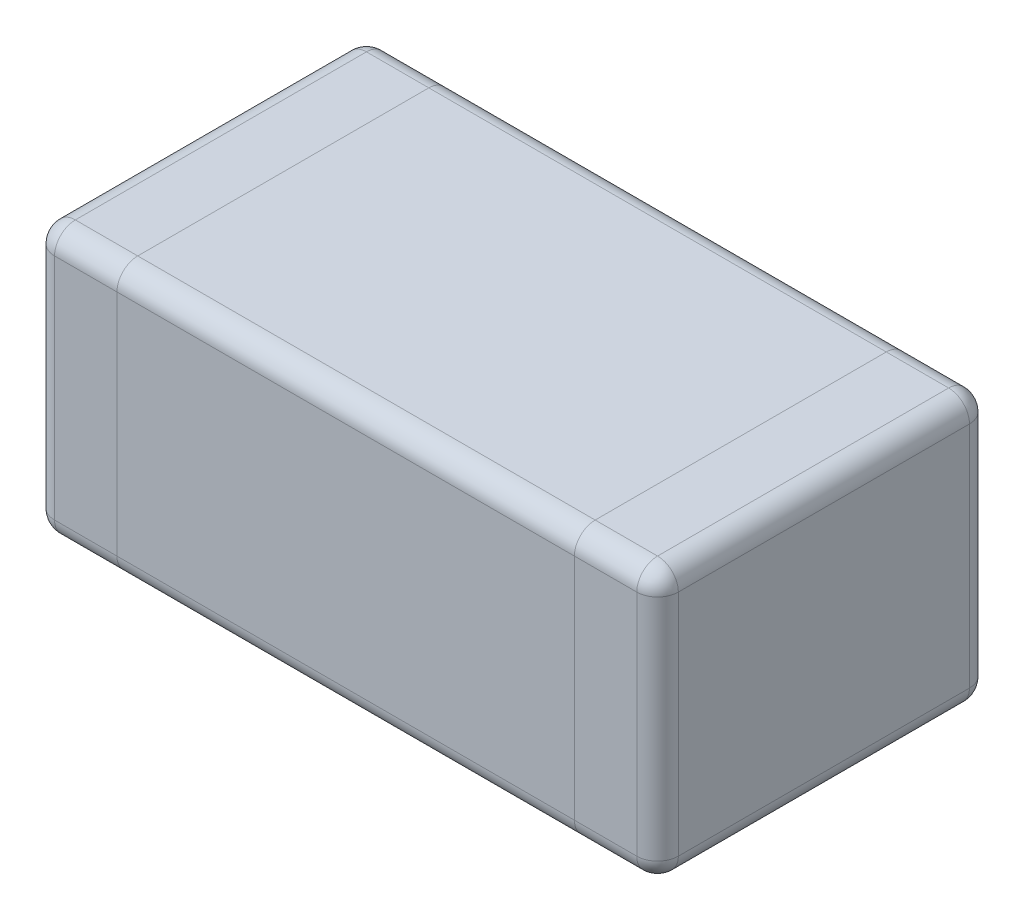
ISO-10303-21;
HEADER;
FILE_DESCRIPTION(('STEP AP214'),'2;1');
FILE_NAME('part.step','',(''),(''),'','','');
FILE_SCHEMA(('AUTOMOTIVE_DESIGN { 1 0 10303 214 1 1 1 1 }'));
ENDSEC;
DATA;
#1=APPLICATION_CONTEXT('core data for automotive mechanical design processes');
#2=APPLICATION_PROTOCOL_DEFINITION('international standard','automotive_design',2000,#1);
#3=PRODUCT_CONTEXT('',#1,'mechanical');
#4=PRODUCT('Part','Part','',(#3));
#5=PRODUCT_RELATED_PRODUCT_CATEGORY('part','',(#4));
#6=PRODUCT_DEFINITION_FORMATION('','',#4);
#7=PRODUCT_DEFINITION_CONTEXT('part definition',#1,'design');
#8=PRODUCT_DEFINITION('design','',#6,#7);
#9=PRODUCT_DEFINITION_SHAPE('','',#8);
#10=(LENGTH_UNIT() NAMED_UNIT(*) SI_UNIT(.MILLI.,.METRE.));
#11=(NAMED_UNIT(*) PLANE_ANGLE_UNIT() SI_UNIT($,.RADIAN.));
#12=(NAMED_UNIT(*) SI_UNIT($,.STERADIAN.) SOLID_ANGLE_UNIT());
#13=UNCERTAINTY_MEASURE_WITH_UNIT(LENGTH_MEASURE(1.E-05),#10,'distance_accuracy_value','');
#14=(GEOMETRIC_REPRESENTATION_CONTEXT(3) GLOBAL_UNCERTAINTY_ASSIGNED_CONTEXT((#13)) GLOBAL_UNIT_ASSIGNED_CONTEXT((#10,
#11,#12)) REPRESENTATION_CONTEXT('',''));
#15=CARTESIAN_POINT('',(0.,0.,0.));
#16=DIRECTION('',(0.,0.,1.));
#17=DIRECTION('',(1.,0.,0.));
#18=AXIS2_PLACEMENT_3D('',#15,#16,#17);
#19=CARTESIAN_POINT('',(0.7,0.65,-0.35));
#20=DIRECTION('',(0.,-1.,0.));
#21=DIRECTION('',(0.,0.,-1.));
#22=AXIS2_PLACEMENT_3D('',#19,#20,#21);
#23=CYLINDRICAL_SURFACE('',#22,0.05);
#24=CARTESIAN_POINT('',(0.7,0.6,-0.35));
#25=DIRECTION('',(0.,-1.,0.));
#26=DIRECTION('',(0.,0.,1.));
#27=AXIS2_PLACEMENT_3D('',#24,#25,#26);
#28=CIRCLE('',#27,0.05);
#29=CARTESIAN_POINT('',(0.7,0.6,-0.4));
#30=VERTEX_POINT('',#29);
#31=CARTESIAN_POINT('',(0.75,0.6,-0.35));
#32=VERTEX_POINT('',#31);
#33=EDGE_CURVE('E27',#30,#32,#28,.T.);
#34=ORIENTED_EDGE('',*,*,#33,.T.);
#35=DIRECTION('',(0.,1.,0.));
#36=VECTOR('',#35,1.);
#37=CARTESIAN_POINT('',(0.75,0.65,-0.35));
#38=LINE('',#37,#36);
#39=CARTESIAN_POINT('',(0.75,0.05,-0.35));
#40=VERTEX_POINT('',#39);
#41=EDGE_CURVE('E397',#40,#32,#38,.T.);
#42=ORIENTED_EDGE('',*,*,#41,.F.);
#43=CARTESIAN_POINT('',(0.7,0.05,-0.35));
#44=DIRECTION('',(0.,1.,0.));
#45=DIRECTION('',(0.,0.,-1.));
#46=AXIS2_PLACEMENT_3D('',#43,#44,#45);
#47=CIRCLE('',#46,0.05);
#48=CARTESIAN_POINT('',(0.7,0.05,-0.4));
#49=VERTEX_POINT('',#48);
#50=EDGE_CURVE('E11',#40,#49,#47,.T.);
#51=ORIENTED_EDGE('',*,*,#50,.T.);
#52=DIRECTION('',(0.,-1.,0.));
#53=VECTOR('',#52,1.);
#54=CARTESIAN_POINT('',(0.7,0.65,-0.4));
#55=LINE('',#54,#53);
#56=EDGE_CURVE('E292',#30,#49,#55,.T.);
#57=ORIENTED_EDGE('',*,*,#56,.F.);
#58=EDGE_LOOP('',(#34,#42,#51,#57));
#59=FACE_BOUND('',#58,.T.);
#60=ADVANCED_FACE('F16',(#59),#23,.T.);
#61=CARTESIAN_POINT('',(0.7,0.05,-0.35));
#62=DIRECTION('',(0.,1.,0.));
#63=DIRECTION('',(1.,0.,0.));
#64=AXIS2_PLACEMENT_3D('',#61,#62,#63);
#65=SPHERICAL_SURFACE('',#64,0.05);
#66=CARTESIAN_POINT('',(0.7,0.05,-0.35));
#67=DIRECTION('',(0.,0.,-1.));
#68=DIRECTION('',(-1.,0.,0.));
#69=AXIS2_PLACEMENT_3D('',#66,#67,#68);
#70=CIRCLE('',#69,0.05);
#71=CARTESIAN_POINT('',(0.7,0.,-0.35));
#72=VERTEX_POINT('',#71);
#73=EDGE_CURVE('E185',#40,#72,#70,.T.);
#74=ORIENTED_EDGE('',*,*,#73,.T.);
#75=CARTESIAN_POINT('',(0.7,0.05,-0.35));
#76=DIRECTION('',(1.,0.,0.));
#77=DIRECTION('',(0.,0.,-1.));
#78=AXIS2_PLACEMENT_3D('',#75,#76,#77);
#79=CIRCLE('',#78,0.05);
#80=EDGE_CURVE('E188',#72,#49,#79,.T.);
#81=ORIENTED_EDGE('',*,*,#80,.T.);
#82=ORIENTED_EDGE('',*,*,#50,.F.);
#83=EDGE_LOOP('',(#74,#81,#82));
#84=FACE_BOUND('',#83,.T.);
#85=ADVANCED_FACE('F187',(#84),#65,.T.);
#86=CARTESIAN_POINT('',(0.7,0.6,-0.35));
#87=DIRECTION('',(0.,1.,0.));
#88=DIRECTION('',(1.,0.,0.));
#89=AXIS2_PLACEMENT_3D('',#86,#87,#88);
#90=SPHERICAL_SURFACE('',#89,0.05);
#91=CARTESIAN_POINT('',(0.7,0.6,-0.35));
#92=DIRECTION('',(1.,0.,0.));
#93=DIRECTION('',(0.,1.,0.));
#94=AXIS2_PLACEMENT_3D('',#91,#92,#93);
#95=CIRCLE('',#94,0.05);
#96=CARTESIAN_POINT('',(0.7,0.65,-0.35));
#97=VERTEX_POINT('',#96);
#98=EDGE_CURVE('E388',#30,#97,#95,.T.);
#99=ORIENTED_EDGE('',*,*,#98,.T.);
#100=CARTESIAN_POINT('',(0.7,0.6,-0.35));
#101=DIRECTION('',(0.,0.,-1.));
#102=DIRECTION('',(-1.,0.,0.));
#103=AXIS2_PLACEMENT_3D('',#100,#101,#102);
#104=CIRCLE('',#103,0.05);
#105=EDGE_CURVE('E195',#97,#32,#104,.T.);
#106=ORIENTED_EDGE('',*,*,#105,.T.);
#107=ORIENTED_EDGE('',*,*,#33,.F.);
#108=EDGE_LOOP('',(#99,#106,#107));
#109=FACE_BOUND('',#108,.T.);
#110=ADVANCED_FACE('F589',(#109),#90,.T.);
#111=CARTESIAN_POINT('',(0.7,0.05,0.4));
#112=DIRECTION('',(0.,0.,1.));
#113=DIRECTION('',(1.,0.,0.));
#114=AXIS2_PLACEMENT_3D('',#111,#112,#113);
#115=CYLINDRICAL_SURFACE('',#114,0.05);
#116=CARTESIAN_POINT('',(0.7,0.05,0.35));
#117=DIRECTION('',(0.,0.,-1.));
#118=DIRECTION('',(1.,0.,0.));
#119=AXIS2_PLACEMENT_3D('',#116,#117,#118);
#120=CIRCLE('',#119,0.05);
#121=CARTESIAN_POINT('',(0.75,0.05,0.35));
#122=VERTEX_POINT('',#121);
#123=CARTESIAN_POINT('',(0.7,0.,0.35));
#124=VERTEX_POINT('',#123);
#125=EDGE_CURVE('E211',#122,#124,#120,.T.);
#126=ORIENTED_EDGE('',*,*,#125,.T.);
#127=DIRECTION('',(0.,0.,1.));
#128=VECTOR('',#127,1.);
#129=CARTESIAN_POINT('',(0.7,0.,0.4));
#130=LINE('',#129,#128);
#131=EDGE_CURVE('E209',#72,#124,#130,.T.);
#132=ORIENTED_EDGE('',*,*,#131,.F.);
#133=ORIENTED_EDGE('',*,*,#73,.F.);
#134=DIRECTION('',(0.,0.,-1.));
#135=VECTOR('',#134,1.);
#136=CARTESIAN_POINT('',(0.75,0.05,-0.4));
#137=LINE('',#136,#135);
#138=EDGE_CURVE('E260',#122,#40,#137,.T.);
#139=ORIENTED_EDGE('',*,*,#138,.F.);
#140=EDGE_LOOP('',(#126,#132,#133,#139));
#141=FACE_BOUND('',#140,.T.);
#142=ADVANCED_FACE('F210',(#141),#115,.T.);
#143=CARTESIAN_POINT('',(-0.75,0.05,-0.35));
#144=DIRECTION('',(1.,0.,0.));
#145=DIRECTION('',(0.,0.,-1.));
#146=AXIS2_PLACEMENT_3D('',#143,#144,#145);
#147=CYLINDRICAL_SURFACE('',#146,0.05);
#148=CARTESIAN_POINT('',(-0.55,0.05,-0.35));
#149=DIRECTION('',(-1.,0.,0.));
#150=DIRECTION('',(0.,0.,-1.));
#151=AXIS2_PLACEMENT_3D('',#148,#149,#150);
#152=CIRCLE('',#151,0.05);
#153=CARTESIAN_POINT('',(-0.55,0.05,-0.4));
#154=VERTEX_POINT('',#153);
#155=CARTESIAN_POINT('',(-0.55,0.,-0.35));
#156=VERTEX_POINT('',#155);
#157=EDGE_CURVE('E372',#154,#156,#152,.T.);
#158=ORIENTED_EDGE('',*,*,#157,.F.);
#159=DIRECTION('',(-1.,0.,0.));
#160=VECTOR('',#159,1.);
#161=CARTESIAN_POINT('',(-0.75,0.05,-0.4));
#162=LINE('',#161,#160);
#163=CARTESIAN_POINT('',(0.55,0.05,-0.4));
#164=VERTEX_POINT('',#163);
#165=EDGE_CURVE('E263',#164,#154,#162,.T.);
#166=ORIENTED_EDGE('',*,*,#165,.F.);
#167=CARTESIAN_POINT('',(0.55,0.05,-0.35));
#168=DIRECTION('',(1.,0.,0.));
#169=DIRECTION('',(0.,0.,1.));
#170=AXIS2_PLACEMENT_3D('',#167,#168,#169);
#171=CIRCLE('',#170,0.05);
#172=CARTESIAN_POINT('',(0.55,0.,-0.35));
#173=VERTEX_POINT('',#172);
#174=EDGE_CURVE('E275',#173,#164,#171,.T.);
#175=ORIENTED_EDGE('',*,*,#174,.F.);
#176=DIRECTION('',(1.,0.,0.));
#177=VECTOR('',#176,1.);
#178=CARTESIAN_POINT('',(0.75,0.,-0.35));
#179=LINE('',#178,#177);
#180=EDGE_CURVE('E242',#156,#173,#179,.T.);
#181=ORIENTED_EDGE('',*,*,#180,.F.);
#182=EDGE_LOOP('',(#158,#166,#175,#181));
#183=FACE_BOUND('',#182,.T.);
#184=ADVANCED_FACE('F601',(#183),#147,.T.);
#185=CARTESIAN_POINT('',(0.75,0.6,-0.35));
#186=DIRECTION('',(-1.,0.,0.));
#187=DIRECTION('',(0.,0.,1.));
#188=AXIS2_PLACEMENT_3D('',#185,#186,#187);
#189=CYLINDRICAL_SURFACE('',#188,0.05);
#190=CARTESIAN_POINT('',(-0.55,0.6,-0.35));
#191=DIRECTION('',(-1.,0.,0.));
#192=DIRECTION('',(0.,0.,-1.));
#193=AXIS2_PLACEMENT_3D('',#190,#191,#192);
#194=CIRCLE('',#193,0.05);
#195=CARTESIAN_POINT('',(-0.55,0.65,-0.35));
#196=VERTEX_POINT('',#195);
#197=CARTESIAN_POINT('',(-0.55,0.6,-0.4));
#198=VERTEX_POINT('',#197);
#199=EDGE_CURVE('E216',#196,#198,#194,.T.);
#200=ORIENTED_EDGE('',*,*,#199,.F.);
#201=DIRECTION('',(-1.,0.,0.));
#202=VECTOR('',#201,1.);
#203=CARTESIAN_POINT('',(0.75,0.65,-0.35));
#204=LINE('',#203,#202);
#205=CARTESIAN_POINT('',(0.55,0.65,-0.35));
#206=VERTEX_POINT('',#205);
#207=EDGE_CURVE('E265',#206,#196,#204,.T.);
#208=ORIENTED_EDGE('',*,*,#207,.F.);
#209=CARTESIAN_POINT('',(0.55,0.6,-0.35));
#210=DIRECTION('',(1.,0.,0.));
#211=DIRECTION('',(0.,0.,1.));
#212=AXIS2_PLACEMENT_3D('',#209,#210,#211);
#213=CIRCLE('',#212,0.05);
#214=CARTESIAN_POINT('',(0.55,0.6,-0.4));
#215=VERTEX_POINT('',#214);
#216=EDGE_CURVE('E351',#215,#206,#213,.T.);
#217=ORIENTED_EDGE('',*,*,#216,.F.);
#218=DIRECTION('',(1.,0.,0.));
#219=VECTOR('',#218,1.);
#220=CARTESIAN_POINT('',(-0.75,0.6,-0.4));
#221=LINE('',#220,#219);
#222=EDGE_CURVE('E466',#198,#215,#221,.T.);
#223=ORIENTED_EDGE('',*,*,#222,.F.);
#224=EDGE_LOOP('',(#200,#208,#217,#223));
#225=FACE_BOUND('',#224,.T.);
#226=ADVANCED_FACE('F606',(#225),#189,.T.);
#227=CARTESIAN_POINT('',(0.7,0.6,-0.4));
#228=DIRECTION('',(0.,0.,-1.));
#229=DIRECTION('',(-1.,0.,0.));
#230=AXIS2_PLACEMENT_3D('',#227,#228,#229);
#231=CYLINDRICAL_SURFACE('',#230,0.05);
#232=CARTESIAN_POINT('',(0.7,0.6,0.35));
#233=DIRECTION('',(0.,0.,-1.));
#234=DIRECTION('',(1.,0.,0.));
#235=AXIS2_PLACEMENT_3D('',#232,#233,#234);
#236=CIRCLE('',#235,0.05);
#237=CARTESIAN_POINT('',(0.7,0.65,0.35));
#238=VERTEX_POINT('',#237);
#239=CARTESIAN_POINT('',(0.75,0.6,0.35));
#240=VERTEX_POINT('',#239);
#241=EDGE_CURVE('E318',#238,#240,#236,.T.);
#242=ORIENTED_EDGE('',*,*,#241,.T.);
#243=DIRECTION('',(0.,0.,1.));
#244=VECTOR('',#243,1.);
#245=CARTESIAN_POINT('',(0.75,0.6,0.4));
#246=LINE('',#245,#244);
#247=EDGE_CURVE('E396',#32,#240,#246,.T.);
#248=ORIENTED_EDGE('',*,*,#247,.F.);
#249=ORIENTED_EDGE('',*,*,#105,.F.);
#250=DIRECTION('',(0.,0.,-1.));
#251=VECTOR('',#250,1.);
#252=CARTESIAN_POINT('',(0.7,0.65,-0.4));
#253=LINE('',#252,#251);
#254=EDGE_CURVE('E333',#238,#97,#253,.T.);
#255=ORIENTED_EDGE('',*,*,#254,.F.);
#256=EDGE_LOOP('',(#242,#248,#249,#255));
#257=FACE_BOUND('',#256,.T.);
#258=ADVANCED_FACE('F587',(#257),#231,.T.);
#259=CARTESIAN_POINT('',(0.7,0.05,0.35));
#260=DIRECTION('',(0.,1.,0.));
#261=DIRECTION('',(1.,0.,0.));
#262=AXIS2_PLACEMENT_3D('',#259,#260,#261);
#263=SPHERICAL_SURFACE('',#262,0.05);
#264=CARTESIAN_POINT('',(0.7,0.05,0.35));
#265=DIRECTION('',(0.,-1.,0.));
#266=DIRECTION('',(0.,0.,-1.));
#267=AXIS2_PLACEMENT_3D('',#264,#265,#266);
#268=CIRCLE('',#267,0.05);
#269=CARTESIAN_POINT('',(0.7,0.05,0.4));
#270=VERTEX_POINT('',#269);
#271=EDGE_CURVE('E316',#122,#270,#268,.T.);
#272=ORIENTED_EDGE('',*,*,#271,.T.);
#273=CARTESIAN_POINT('',(0.7,0.05,0.35));
#274=DIRECTION('',(1.,0.,0.));
#275=DIRECTION('',(0.,0.,-1.));
#276=AXIS2_PLACEMENT_3D('',#273,#274,#275);
#277=CIRCLE('',#276,0.05);
#278=EDGE_CURVE('E274',#270,#124,#277,.T.);
#279=ORIENTED_EDGE('',*,*,#278,.T.);
#280=ORIENTED_EDGE('',*,*,#125,.F.);
#281=EDGE_LOOP('',(#272,#279,#280));
#282=FACE_BOUND('',#281,.T.);
#283=ADVANCED_FACE('F660',(#282),#263,.T.);
#284=CARTESIAN_POINT('',(-0.7,0.05,-0.35));
#285=DIRECTION('',(0.,1.,0.));
#286=DIRECTION('',(1.,0.,0.));
#287=AXIS2_PLACEMENT_3D('',#284,#285,#286);
#288=SPHERICAL_SURFACE('',#287,0.05);
#289=CARTESIAN_POINT('',(-0.7,0.05,-0.35));
#290=DIRECTION('',(0.,0.,-1.));
#291=DIRECTION('',(-1.,0.,0.));
#292=AXIS2_PLACEMENT_3D('',#289,#290,#291);
#293=CIRCLE('',#292,0.05);
#294=CARTESIAN_POINT('',(-0.7,0.,-0.35));
#295=VERTEX_POINT('',#294);
#296=CARTESIAN_POINT('',(-0.75,0.05,-0.35));
#297=VERTEX_POINT('',#296);
#298=EDGE_CURVE('E41',#295,#297,#293,.T.);
#299=ORIENTED_EDGE('',*,*,#298,.T.);
#300=CARTESIAN_POINT('',(-0.7,0.05,-0.35));
#301=DIRECTION('',(0.,-1.,0.));
#302=DIRECTION('',(0.,0.,-1.));
#303=AXIS2_PLACEMENT_3D('',#300,#301,#302);
#304=CIRCLE('',#303,0.05);
#305=CARTESIAN_POINT('',(-0.7,0.05,-0.4));
#306=VERTEX_POINT('',#305);
#307=EDGE_CURVE('E232',#297,#306,#304,.T.);
#308=ORIENTED_EDGE('',*,*,#307,.T.);
#309=CARTESIAN_POINT('',(-0.7,0.05,-0.35));
#310=DIRECTION('',(1.,0.,0.));
#311=DIRECTION('',(0.,0.,1.));
#312=AXIS2_PLACEMENT_3D('',#309,#310,#311);
#313=CIRCLE('',#312,0.05);
#314=EDGE_CURVE('E278',#295,#306,#313,.T.);
#315=ORIENTED_EDGE('',*,*,#314,.F.);
#316=EDGE_LOOP('',(#299,#308,#315));
#317=FACE_BOUND('',#316,.T.);
#318=ADVANCED_FACE('F657',(#317),#288,.T.);
#319=CARTESIAN_POINT('',(-0.7,0.6,-0.35));
#320=DIRECTION('',(0.,1.,0.));
#321=DIRECTION('',(1.,0.,0.));
#322=AXIS2_PLACEMENT_3D('',#319,#320,#321);
#323=SPHERICAL_SURFACE('',#322,0.05);
#324=CARTESIAN_POINT('',(-0.7,0.6,-0.35));
#325=DIRECTION('',(0.,1.,0.));
#326=DIRECTION('',(0.,0.,1.));
#327=AXIS2_PLACEMENT_3D('',#324,#325,#326);
#328=CIRCLE('',#327,0.05);
#329=CARTESIAN_POINT('',(-0.7,0.6,-0.4));
#330=VERTEX_POINT('',#329);
#331=CARTESIAN_POINT('',(-0.75,0.6,-0.35));
#332=VERTEX_POINT('',#331);
#333=EDGE_CURVE('E234',#330,#332,#328,.T.);
#334=ORIENTED_EDGE('',*,*,#333,.T.);
#335=CARTESIAN_POINT('',(-0.7,0.6,-0.35));
#336=DIRECTION('',(0.,0.,-1.));
#337=DIRECTION('',(-1.,0.,0.));
#338=AXIS2_PLACEMENT_3D('',#335,#336,#337);
#339=CIRCLE('',#338,0.05);
#340=CARTESIAN_POINT('',(-0.7,0.65,-0.35));
#341=VERTEX_POINT('',#340);
#342=EDGE_CURVE('E235',#332,#341,#339,.T.);
#343=ORIENTED_EDGE('',*,*,#342,.T.);
#344=CARTESIAN_POINT('',(-0.7,0.6,-0.35));
#345=DIRECTION('',(1.,0.,0.));
#346=DIRECTION('',(0.,0.,1.));
#347=AXIS2_PLACEMENT_3D('',#344,#345,#346);
#348=CIRCLE('',#347,0.05);
#349=EDGE_CURVE('E306',#330,#341,#348,.T.);
#350=ORIENTED_EDGE('',*,*,#349,.F.);
#351=EDGE_LOOP('',(#334,#343,#350));
#352=FACE_BOUND('',#351,.T.);
#353=ADVANCED_FACE('F18',(#352),#323,.T.);
#354=CARTESIAN_POINT('',(0.7,0.6,0.35));
#355=DIRECTION('',(0.,1.,0.));
#356=DIRECTION('',(1.,0.,0.));
#357=AXIS2_PLACEMENT_3D('',#354,#355,#356);
#358=SPHERICAL_SURFACE('',#357,0.05);
#359=CARTESIAN_POINT('',(0.7,0.6,0.35));
#360=DIRECTION('',(1.,0.,0.));
#361=DIRECTION('',(0.,0.,-1.));
#362=AXIS2_PLACEMENT_3D('',#359,#360,#361);
#363=CIRCLE('',#362,0.05);
#364=CARTESIAN_POINT('',(0.7,0.6,0.4));
#365=VERTEX_POINT('',#364);
#366=EDGE_CURVE('E453',#238,#365,#363,.T.);
#367=ORIENTED_EDGE('',*,*,#366,.T.);
#368=CARTESIAN_POINT('',(0.7,0.6,0.35));
#369=DIRECTION('',(0.,1.,0.));
#370=DIRECTION('',(0.,0.,1.));
#371=AXIS2_PLACEMENT_3D('',#368,#369,#370);
#372=CIRCLE('',#371,0.05);
#373=EDGE_CURVE('E319',#365,#240,#372,.T.);
#374=ORIENTED_EDGE('',*,*,#373,.T.);
#375=ORIENTED_EDGE('',*,*,#241,.F.);
#376=EDGE_LOOP('',(#367,#374,#375));
#377=FACE_BOUND('',#376,.T.);
#378=ADVANCED_FACE('F575',(#377),#358,.T.);
#379=CARTESIAN_POINT('',(0.7,0.65,0.35));
#380=DIRECTION('',(0.,-1.,0.));
#381=DIRECTION('',(0.,0.,-1.));
#382=AXIS2_PLACEMENT_3D('',#379,#380,#381);
#383=CYLINDRICAL_SURFACE('',#382,0.05);
#384=ORIENTED_EDGE('',*,*,#373,.F.);
#385=DIRECTION('',(0.,1.,0.));
#386=VECTOR('',#385,1.);
#387=CARTESIAN_POINT('',(0.7,0.65,0.4));
#388=LINE('',#387,#386);
#389=EDGE_CURVE('E287',#270,#365,#388,.T.);
#390=ORIENTED_EDGE('',*,*,#389,.F.);
#391=ORIENTED_EDGE('',*,*,#271,.F.);
#392=DIRECTION('',(0.,-1.,0.));
#393=VECTOR('',#392,1.);
#394=CARTESIAN_POINT('',(0.75,0.65,0.35));
#395=LINE('',#394,#393);
#396=EDGE_CURVE('E264',#240,#122,#395,.T.);
#397=ORIENTED_EDGE('',*,*,#396,.F.);
#398=EDGE_LOOP('',(#384,#390,#391,#397));
#399=FACE_BOUND('',#398,.T.);
#400=ADVANCED_FACE('F583',(#399),#383,.T.);
#401=CARTESIAN_POINT('',(-0.75,0.05,0.35));
#402=DIRECTION('',(-1.,0.,0.));
#403=DIRECTION('',(0.,0.,1.));
#404=AXIS2_PLACEMENT_3D('',#401,#402,#403);
#405=CYLINDRICAL_SURFACE('',#404,0.05);
#406=CARTESIAN_POINT('',(-0.55,0.05,0.35));
#407=DIRECTION('',(-1.,0.,0.));
#408=DIRECTION('',(0.,0.,-1.));
#409=AXIS2_PLACEMENT_3D('',#406,#407,#408);
#410=CIRCLE('',#409,0.05);
#411=CARTESIAN_POINT('',(-0.55,0.,0.35));
#412=VERTEX_POINT('',#411);
#413=CARTESIAN_POINT('',(-0.55,0.05,0.4));
#414=VERTEX_POINT('',#413);
#415=EDGE_CURVE('E297',#412,#414,#410,.T.);
#416=ORIENTED_EDGE('',*,*,#415,.F.);
#417=DIRECTION('',(-1.,0.,0.));
#418=VECTOR('',#417,1.);
#419=CARTESIAN_POINT('',(-0.75,0.,0.35));
#420=LINE('',#419,#418);
#421=CARTESIAN_POINT('',(0.55,0.,0.35));
#422=VERTEX_POINT('',#421);
#423=EDGE_CURVE('E245',#422,#412,#420,.T.);
#424=ORIENTED_EDGE('',*,*,#423,.F.);
#425=CARTESIAN_POINT('',(0.55,0.05,0.35));
#426=DIRECTION('',(1.,0.,0.));
#427=DIRECTION('',(0.,0.,1.));
#428=AXIS2_PLACEMENT_3D('',#425,#426,#427);
#429=CIRCLE('',#428,0.05);
#430=CARTESIAN_POINT('',(0.55,0.05,0.4));
#431=VERTEX_POINT('',#430);
#432=EDGE_CURVE('E247',#431,#422,#429,.T.);
#433=ORIENTED_EDGE('',*,*,#432,.F.);
#434=DIRECTION('',(1.,0.,0.));
#435=VECTOR('',#434,1.);
#436=CARTESIAN_POINT('',(0.75,0.05,0.4));
#437=LINE('',#436,#435);
#438=EDGE_CURVE('E268',#414,#431,#437,.T.);
#439=ORIENTED_EDGE('',*,*,#438,.F.);
#440=EDGE_LOOP('',(#416,#424,#433,#439));
#441=FACE_BOUND('',#440,.T.);
#442=ADVANCED_FACE('F672',(#441),#405,.T.);
#443=CARTESIAN_POINT('',(-0.7,0.05,0.4));
#444=DIRECTION('',(0.,0.,-1.));
#445=DIRECTION('',(-1.,0.,0.));
#446=AXIS2_PLACEMENT_3D('',#443,#444,#445);
#447=CYLINDRICAL_SURFACE('',#446,0.05);
#448=CARTESIAN_POINT('',(-0.7,0.05,0.35));
#449=DIRECTION('',(0.,0.,-1.));
#450=DIRECTION('',(1.,0.,0.));
#451=AXIS2_PLACEMENT_3D('',#448,#449,#450);
#452=CIRCLE('',#451,0.05);
#453=CARTESIAN_POINT('',(-0.7,0.,0.35));
#454=VERTEX_POINT('',#453);
#455=CARTESIAN_POINT('',(-0.75,0.05,0.35));
#456=VERTEX_POINT('',#455);
#457=EDGE_CURVE('E279',#454,#456,#452,.T.);
#458=ORIENTED_EDGE('',*,*,#457,.T.);
#459=DIRECTION('',(0.,0.,1.));
#460=VECTOR('',#459,1.);
#461=CARTESIAN_POINT('',(-0.75,0.05,0.4));
#462=LINE('',#461,#460);
#463=EDGE_CURVE('E301',#297,#456,#462,.T.);
#464=ORIENTED_EDGE('',*,*,#463,.F.);
#465=ORIENTED_EDGE('',*,*,#298,.F.);
#466=DIRECTION('',(0.,0.,-1.));
#467=VECTOR('',#466,1.);
#468=CARTESIAN_POINT('',(-0.7,0.,-0.4));
#469=LINE('',#468,#467);
#470=EDGE_CURVE('E227',#454,#295,#469,.T.);
#471=ORIENTED_EDGE('',*,*,#470,.F.);
#472=EDGE_LOOP('',(#458,#464,#465,#471));
#473=FACE_BOUND('',#472,.T.);
#474=ADVANCED_FACE('F669',(#473),#447,.T.);
#475=CARTESIAN_POINT('',(-0.7,0.65,-0.35));
#476=DIRECTION('',(0.,-1.,0.));
#477=DIRECTION('',(0.,0.,-1.));
#478=AXIS2_PLACEMENT_3D('',#475,#476,#477);
#479=CYLINDRICAL_SURFACE('',#478,0.05);
#480=ORIENTED_EDGE('',*,*,#307,.F.);
#481=DIRECTION('',(0.,-1.,0.));
#482=VECTOR('',#481,1.);
#483=CARTESIAN_POINT('',(-0.75,0.65,-0.35));
#484=LINE('',#483,#482);
#485=EDGE_CURVE('E410',#332,#297,#484,.T.);
#486=ORIENTED_EDGE('',*,*,#485,.F.);
#487=ORIENTED_EDGE('',*,*,#333,.F.);
#488=DIRECTION('',(0.,1.,0.));
#489=VECTOR('',#488,1.);
#490=CARTESIAN_POINT('',(-0.7,0.65,-0.4));
#491=LINE('',#490,#489);
#492=EDGE_CURVE('E253',#306,#330,#491,.T.);
#493=ORIENTED_EDGE('',*,*,#492,.F.);
#494=EDGE_LOOP('',(#480,#486,#487,#493));
#495=FACE_BOUND('',#494,.T.);
#496=ADVANCED_FACE('F617',(#495),#479,.T.);
#497=CARTESIAN_POINT('',(-0.7,0.6,-0.4));
#498=DIRECTION('',(0.,0.,1.));
#499=DIRECTION('',(1.,0.,0.));
#500=AXIS2_PLACEMENT_3D('',#497,#498,#499);
#501=CYLINDRICAL_SURFACE('',#500,0.05);
#502=CARTESIAN_POINT('',(-0.7,0.6,0.35));
#503=DIRECTION('',(0.,0.,-1.));
#504=DIRECTION('',(1.,0.,0.));
#505=AXIS2_PLACEMENT_3D('',#502,#503,#504);
#506=CIRCLE('',#505,0.05);
#507=CARTESIAN_POINT('',(-0.75,0.6,0.35));
#508=VERTEX_POINT('',#507);
#509=CARTESIAN_POINT('',(-0.7,0.65,0.35));
#510=VERTEX_POINT('',#509);
#511=EDGE_CURVE('E282',#508,#510,#506,.T.);
#512=ORIENTED_EDGE('',*,*,#511,.T.);
#513=DIRECTION('',(0.,0.,1.));
#514=VECTOR('',#513,1.);
#515=CARTESIAN_POINT('',(-0.7,0.65,-0.4));
#516=LINE('',#515,#514);
#517=EDGE_CURVE('E311',#341,#510,#516,.T.);
#518=ORIENTED_EDGE('',*,*,#517,.F.);
#519=ORIENTED_EDGE('',*,*,#342,.F.);
#520=DIRECTION('',(0.,0.,-1.));
#521=VECTOR('',#520,1.);
#522=CARTESIAN_POINT('',(-0.75,0.6,0.4));
#523=LINE('',#522,#521);
#524=EDGE_CURVE('E472',#508,#332,#523,.T.);
#525=ORIENTED_EDGE('',*,*,#524,.F.);
#526=EDGE_LOOP('',(#512,#518,#519,#525));
#527=FACE_BOUND('',#526,.T.);
#528=ADVANCED_FACE('F547',(#527),#501,.T.);
#529=CARTESIAN_POINT('',(0.75,0.6,0.35));
#530=DIRECTION('',(1.,0.,0.));
#531=DIRECTION('',(0.,0.,-1.));
#532=AXIS2_PLACEMENT_3D('',#529,#530,#531);
#533=CYLINDRICAL_SURFACE('',#532,0.05);
#534=CARTESIAN_POINT('',(-0.55,0.6,0.35));
#535=DIRECTION('',(-1.,0.,0.));
#536=DIRECTION('',(0.,0.,-1.));
#537=AXIS2_PLACEMENT_3D('',#534,#535,#536);
#538=CIRCLE('',#537,0.05);
#539=CARTESIAN_POINT('',(-0.55,0.6,0.4));
#540=VERTEX_POINT('',#539);
#541=CARTESIAN_POINT('',(-0.55,0.65,0.35));
#542=VERTEX_POINT('',#541);
#543=EDGE_CURVE('E506',#540,#542,#538,.T.);
#544=ORIENTED_EDGE('',*,*,#543,.F.);
#545=DIRECTION('',(-1.,0.,0.));
#546=VECTOR('',#545,1.);
#547=CARTESIAN_POINT('',(-0.75,0.6,0.4));
#548=LINE('',#547,#546);
#549=CARTESIAN_POINT('',(0.55,0.6,0.4));
#550=VERTEX_POINT('',#549);
#551=EDGE_CURVE('E298',#550,#540,#548,.T.);
#552=ORIENTED_EDGE('',*,*,#551,.F.);
#553=CARTESIAN_POINT('',(0.55,0.6,0.35));
#554=DIRECTION('',(1.,0.,0.));
#555=DIRECTION('',(0.,0.,1.));
#556=AXIS2_PLACEMENT_3D('',#553,#554,#555);
#557=CIRCLE('',#556,0.05);
#558=CARTESIAN_POINT('',(0.55,0.65,0.35));
#559=VERTEX_POINT('',#558);
#560=EDGE_CURVE('E363',#559,#550,#557,.T.);
#561=ORIENTED_EDGE('',*,*,#560,.F.);
#562=DIRECTION('',(1.,0.,0.));
#563=VECTOR('',#562,1.);
#564=CARTESIAN_POINT('',(0.75,0.65,0.35));
#565=LINE('',#564,#563);
#566=EDGE_CURVE('E246',#542,#559,#565,.T.);
#567=ORIENTED_EDGE('',*,*,#566,.F.);
#568=EDGE_LOOP('',(#544,#552,#561,#567));
#569=FACE_BOUND('',#568,.T.);
#570=ADVANCED_FACE('F446',(#569),#533,.T.);
#571=CARTESIAN_POINT('',(-0.7,0.05,0.35));
#572=DIRECTION('',(0.,1.,0.));
#573=DIRECTION('',(1.,0.,0.));
#574=AXIS2_PLACEMENT_3D('',#571,#572,#573);
#575=SPHERICAL_SURFACE('',#574,0.05);
#576=CARTESIAN_POINT('',(-0.7,0.05,0.35));
#577=DIRECTION('',(1.,0.,0.));
#578=DIRECTION('',(0.,0.,1.));
#579=AXIS2_PLACEMENT_3D('',#576,#577,#578);
#580=CIRCLE('',#579,0.05);
#581=CARTESIAN_POINT('',(-0.7,0.05,0.4));
#582=VERTEX_POINT('',#581);
#583=EDGE_CURVE('E252',#582,#454,#580,.T.);
#584=ORIENTED_EDGE('',*,*,#583,.F.);
#585=CARTESIAN_POINT('',(-0.7,0.05,0.35));
#586=DIRECTION('',(0.,-1.,0.));
#587=DIRECTION('',(0.,0.,-1.));
#588=AXIS2_PLACEMENT_3D('',#585,#586,#587);
#589=CIRCLE('',#588,0.05);
#590=EDGE_CURVE('E477',#582,#456,#589,.T.);
#591=ORIENTED_EDGE('',*,*,#590,.T.);
#592=ORIENTED_EDGE('',*,*,#457,.F.);
#593=EDGE_LOOP('',(#584,#591,#592));
#594=FACE_BOUND('',#593,.T.);
#595=ADVANCED_FACE('F554',(#594),#575,.T.);
#596=CARTESIAN_POINT('',(-0.7,0.6,0.35));
#597=DIRECTION('',(0.,1.,0.));
#598=DIRECTION('',(1.,0.,0.));
#599=AXIS2_PLACEMENT_3D('',#596,#597,#598);
#600=SPHERICAL_SURFACE('',#599,0.05);
#601=ORIENTED_EDGE('',*,*,#511,.F.);
#602=CARTESIAN_POINT('',(-0.7,0.6,0.35));
#603=DIRECTION('',(0.,1.,0.));
#604=DIRECTION('',(0.,0.,1.));
#605=AXIS2_PLACEMENT_3D('',#602,#603,#604);
#606=CIRCLE('',#605,0.05);
#607=CARTESIAN_POINT('',(-0.7,0.6,0.4));
#608=VERTEX_POINT('',#607);
#609=EDGE_CURVE('E392',#508,#608,#606,.T.);
#610=ORIENTED_EDGE('',*,*,#609,.T.);
#611=CARTESIAN_POINT('',(-0.7,0.6,0.35));
#612=DIRECTION('',(1.,0.,0.));
#613=DIRECTION('',(0.,-1.,0.));
#614=AXIS2_PLACEMENT_3D('',#611,#612,#613);
#615=CIRCLE('',#614,0.05);
#616=EDGE_CURVE('E368',#510,#608,#615,.T.);
#617=ORIENTED_EDGE('',*,*,#616,.F.);
#618=EDGE_LOOP('',(#601,#610,#617));
#619=FACE_BOUND('',#618,.T.);
#620=ADVANCED_FACE('F550',(#619),#600,.T.);
#621=CARTESIAN_POINT('',(-0.7,0.65,0.35));
#622=DIRECTION('',(0.,-1.,0.));
#623=DIRECTION('',(0.,0.,-1.));
#624=AXIS2_PLACEMENT_3D('',#621,#622,#623);
#625=CYLINDRICAL_SURFACE('',#624,0.05);
#626=ORIENTED_EDGE('',*,*,#609,.F.);
#627=DIRECTION('',(0.,1.,0.));
#628=VECTOR('',#627,1.);
#629=CARTESIAN_POINT('',(-0.75,0.65,0.35));
#630=LINE('',#629,#628);
#631=EDGE_CURVE('E469',#456,#508,#630,.T.);
#632=ORIENTED_EDGE('',*,*,#631,.F.);
#633=ORIENTED_EDGE('',*,*,#590,.F.);
#634=DIRECTION('',(0.,-1.,0.));
#635=VECTOR('',#634,1.);
#636=CARTESIAN_POINT('',(-0.7,0.65,0.4));
#637=LINE('',#636,#635);
#638=EDGE_CURVE('E236',#608,#582,#637,.T.);
#639=ORIENTED_EDGE('',*,*,#638,.F.);
#640=EDGE_LOOP('',(#626,#632,#633,#639));
#641=FACE_BOUND('',#640,.T.);
#642=ADVANCED_FACE('F553',(#641),#625,.T.);
#643=CARTESIAN_POINT('',(0.75,0.,-0.4));
#644=DIRECTION('',(0.,-1.,0.));
#645=DIRECTION('',(0.,0.,-1.));
#646=AXIS2_PLACEMENT_3D('',#643,#644,#645);
#647=PLANE('',#646);
#648=DIRECTION('',(0.,0.,1.));
#649=VECTOR('',#648,1.);
#650=CARTESIAN_POINT('',(-0.55,0.,-0.4));
#651=LINE('',#650,#649);
#652=EDGE_CURVE('E273',#156,#412,#651,.T.);
#653=ORIENTED_EDGE('',*,*,#652,.F.);
#654=ORIENTED_EDGE('',*,*,#180,.T.);
#655=DIRECTION('',(0.,0.,-1.));
#656=VECTOR('',#655,1.);
#657=CARTESIAN_POINT('',(0.55,0.,-0.4));
#658=LINE('',#657,#656);
#659=EDGE_CURVE('E220',#422,#173,#658,.T.);
#660=ORIENTED_EDGE('',*,*,#659,.F.);
#661=ORIENTED_EDGE('',*,*,#423,.T.);
#662=EDGE_LOOP('',(#653,#654,#660,#661));
#663=FACE_BOUND('',#662,.T.);
#664=ADVANCED_FACE('F640',(#663),#647,.T.);
#665=CARTESIAN_POINT('',(0.75,0.65,-0.4));
#666=DIRECTION('',(0.,-1.,0.));
#667=DIRECTION('',(0.,0.,-1.));
#668=AXIS2_PLACEMENT_3D('',#665,#666,#667);
#669=PLANE('',#668);
#670=ORIENTED_EDGE('',*,*,#207,.T.);
#671=DIRECTION('',(0.,0.,1.));
#672=VECTOR('',#671,1.);
#673=CARTESIAN_POINT('',(-0.55,0.65,-0.4));
#674=LINE('',#673,#672);
#675=EDGE_CURVE('E312',#196,#542,#674,.T.);
#676=ORIENTED_EDGE('',*,*,#675,.T.);
#677=ORIENTED_EDGE('',*,*,#566,.T.);
#678=DIRECTION('',(0.,0.,-1.));
#679=VECTOR('',#678,1.);
#680=CARTESIAN_POINT('',(0.55,0.65,-0.4));
#681=LINE('',#680,#679);
#682=EDGE_CURVE('E325',#559,#206,#681,.T.);
#683=ORIENTED_EDGE('',*,*,#682,.T.);
#684=EDGE_LOOP('',(#670,#676,#677,#683));
#685=FACE_BOUND('',#684,.T.);
#686=ADVANCED_FACE('F437',(#685),#669,.F.);
#687=CARTESIAN_POINT('',(-0.75,0.65,0.4));
#688=DIRECTION('',(0.,0.,-1.));
#689=DIRECTION('',(0.,-1.,0.));
#690=AXIS2_PLACEMENT_3D('',#687,#688,#689);
#691=PLANE('',#690);
#692=ORIENTED_EDGE('',*,*,#551,.T.);
#693=DIRECTION('',(0.,-1.,0.));
#694=VECTOR('',#693,1.);
#695=CARTESIAN_POINT('',(-0.55,0.65,0.4));
#696=LINE('',#695,#694);
#697=EDGE_CURVE('E241',#540,#414,#696,.T.);
#698=ORIENTED_EDGE('',*,*,#697,.T.);
#699=ORIENTED_EDGE('',*,*,#438,.T.);
#700=DIRECTION('',(0.,1.,0.));
#701=VECTOR('',#700,1.);
#702=CARTESIAN_POINT('',(0.55,0.65,0.4));
#703=LINE('',#702,#701);
#704=EDGE_CURVE('E288',#431,#550,#703,.T.);
#705=ORIENTED_EDGE('',*,*,#704,.T.);
#706=EDGE_LOOP('',(#692,#698,#699,#705));
#707=FACE_BOUND('',#706,.T.);
#708=ADVANCED_FACE('F663',(#707),#691,.F.);
#709=CARTESIAN_POINT('',(-0.75,0.65,0.4));
#710=DIRECTION('',(1.,0.,0.));
#711=DIRECTION('',(0.,1.,0.));
#712=AXIS2_PLACEMENT_3D('',#709,#710,#711);
#713=PLANE('',#712);
#714=ORIENTED_EDGE('',*,*,#631,.T.);
#715=ORIENTED_EDGE('',*,*,#524,.T.);
#716=ORIENTED_EDGE('',*,*,#485,.T.);
#717=ORIENTED_EDGE('',*,*,#463,.T.);
#718=EDGE_LOOP('',(#714,#715,#716,#717));
#719=FACE_BOUND('',#718,.T.);
#720=ADVANCED_FACE('F666',(#719),#713,.F.);
#721=CARTESIAN_POINT('',(-0.75,0.65,-0.4));
#722=DIRECTION('',(0.,0.,1.));
#723=DIRECTION('',(1.,0.,0.));
#724=AXIS2_PLACEMENT_3D('',#721,#722,#723);
#725=PLANE('',#724);
#726=ORIENTED_EDGE('',*,*,#165,.T.);
#727=DIRECTION('',(0.,1.,0.));
#728=VECTOR('',#727,1.);
#729=CARTESIAN_POINT('',(-0.55,0.65,-0.4));
#730=LINE('',#729,#728);
#731=EDGE_CURVE('E20',#154,#198,#730,.T.);
#732=ORIENTED_EDGE('',*,*,#731,.T.);
#733=ORIENTED_EDGE('',*,*,#222,.T.);
#734=DIRECTION('',(0.,-1.,0.));
#735=VECTOR('',#734,1.);
#736=CARTESIAN_POINT('',(0.55,0.65,-0.4));
#737=LINE('',#736,#735);
#738=EDGE_CURVE('E257',#215,#164,#737,.T.);
#739=ORIENTED_EDGE('',*,*,#738,.T.);
#740=EDGE_LOOP('',(#726,#732,#733,#739));
#741=FACE_BOUND('',#740,.T.);
#742=ADVANCED_FACE('F605',(#741),#725,.F.);
#743=CARTESIAN_POINT('',(0.75,0.65,0.4));
#744=DIRECTION('',(-1.,0.,0.));
#745=DIRECTION('',(0.,0.,1.));
#746=AXIS2_PLACEMENT_3D('',#743,#744,#745);
#747=PLANE('',#746);
#748=ORIENTED_EDGE('',*,*,#41,.T.);
#749=ORIENTED_EDGE('',*,*,#247,.T.);
#750=ORIENTED_EDGE('',*,*,#396,.T.);
#751=ORIENTED_EDGE('',*,*,#138,.T.);
#752=EDGE_LOOP('',(#748,#749,#750,#751));
#753=FACE_BOUND('',#752,.T.);
#754=ADVANCED_FACE('F585',(#753),#747,.F.);
#755=CARTESIAN_POINT('',(-0.75,0.65,-0.4));
#756=DIRECTION('',(0.,0.,1.));
#757=DIRECTION('',(1.,0.,0.));
#758=AXIS2_PLACEMENT_3D('',#755,#756,#757);
#759=PLANE('',#758);
#760=ORIENTED_EDGE('',*,*,#738,.F.);
#761=DIRECTION('',(1.,0.,0.));
#762=VECTOR('',#761,1.);
#763=CARTESIAN_POINT('',(-0.75,0.6,-0.4));
#764=LINE('',#763,#762);
#765=EDGE_CURVE('E362',#215,#30,#764,.T.);
#766=ORIENTED_EDGE('',*,*,#765,.T.);
#767=ORIENTED_EDGE('',*,*,#56,.T.);
#768=DIRECTION('',(-1.,0.,0.));
#769=VECTOR('',#768,1.);
#770=CARTESIAN_POINT('',(-0.75,0.05,-0.4));
#771=LINE('',#770,#769);
#772=EDGE_CURVE('E205',#49,#164,#771,.T.);
#773=ORIENTED_EDGE('',*,*,#772,.T.);
#774=EDGE_LOOP('',(#760,#766,#767,#773));
#775=FACE_BOUND('',#774,.T.);
#776=ADVANCED_FACE('F595',(#775),#759,.F.);
#777=CARTESIAN_POINT('',(-0.75,0.65,-0.4));
#778=DIRECTION('',(0.,0.,1.));
#779=DIRECTION('',(1.,0.,0.));
#780=AXIS2_PLACEMENT_3D('',#777,#778,#779);
#781=PLANE('',#780);
#782=ORIENTED_EDGE('',*,*,#731,.F.);
#783=DIRECTION('',(-1.,0.,0.));
#784=VECTOR('',#783,1.);
#785=CARTESIAN_POINT('',(-0.75,0.05,-0.4));
#786=LINE('',#785,#784);
#787=EDGE_CURVE('E380',#154,#306,#786,.T.);
#788=ORIENTED_EDGE('',*,*,#787,.T.);
#789=ORIENTED_EDGE('',*,*,#492,.T.);
#790=DIRECTION('',(1.,0.,0.));
#791=VECTOR('',#790,1.);
#792=CARTESIAN_POINT('',(-0.75,0.6,-0.4));
#793=LINE('',#792,#791);
#794=EDGE_CURVE('E302',#330,#198,#793,.T.);
#795=ORIENTED_EDGE('',*,*,#794,.T.);
#796=EDGE_LOOP('',(#782,#788,#789,#795));
#797=FACE_BOUND('',#796,.T.);
#798=ADVANCED_FACE('F619',(#797),#781,.F.);
#799=CARTESIAN_POINT('',(-0.75,0.05,-0.35));
#800=DIRECTION('',(1.,0.,0.));
#801=DIRECTION('',(0.,0.,-1.));
#802=AXIS2_PLACEMENT_3D('',#799,#800,#801);
#803=CYLINDRICAL_SURFACE('',#802,0.05);
#804=DIRECTION('',(1.,0.,0.));
#805=VECTOR('',#804,1.);
#806=CARTESIAN_POINT('',(0.75,0.,-0.35));
#807=LINE('',#806,#805);
#808=EDGE_CURVE('E202',#173,#72,#807,.T.);
#809=ORIENTED_EDGE('',*,*,#808,.F.);
#810=ORIENTED_EDGE('',*,*,#174,.T.);
#811=ORIENTED_EDGE('',*,*,#772,.F.);
#812=ORIENTED_EDGE('',*,*,#80,.F.);
#813=EDGE_LOOP('',(#809,#810,#811,#812));
#814=FACE_BOUND('',#813,.T.);
#815=ADVANCED_FACE('F199',(#814),#803,.T.);
#816=CARTESIAN_POINT('',(-0.75,0.05,-0.35));
#817=DIRECTION('',(1.,0.,0.));
#818=DIRECTION('',(0.,0.,-1.));
#819=AXIS2_PLACEMENT_3D('',#816,#817,#818);
#820=CYLINDRICAL_SURFACE('',#819,0.05);
#821=ORIENTED_EDGE('',*,*,#787,.F.);
#822=ORIENTED_EDGE('',*,*,#157,.T.);
#823=DIRECTION('',(1.,0.,0.));
#824=VECTOR('',#823,1.);
#825=CARTESIAN_POINT('',(0.75,0.,-0.35));
#826=LINE('',#825,#824);
#827=EDGE_CURVE('E269',#295,#156,#826,.T.);
#828=ORIENTED_EDGE('',*,*,#827,.F.);
#829=ORIENTED_EDGE('',*,*,#314,.T.);
#830=EDGE_LOOP('',(#821,#822,#828,#829));
#831=FACE_BOUND('',#830,.T.);
#832=ADVANCED_FACE('F620',(#831),#820,.T.);
#833=CARTESIAN_POINT('',(0.75,0.6,-0.35));
#834=DIRECTION('',(-1.,0.,0.));
#835=DIRECTION('',(0.,0.,1.));
#836=AXIS2_PLACEMENT_3D('',#833,#834,#835);
#837=CYLINDRICAL_SURFACE('',#836,0.05);
#838=ORIENTED_EDGE('',*,*,#765,.F.);
#839=ORIENTED_EDGE('',*,*,#216,.T.);
#840=DIRECTION('',(-1.,0.,0.));
#841=VECTOR('',#840,1.);
#842=CARTESIAN_POINT('',(0.75,0.65,-0.35));
#843=LINE('',#842,#841);
#844=EDGE_CURVE('E329',#97,#206,#843,.T.);
#845=ORIENTED_EDGE('',*,*,#844,.F.);
#846=ORIENTED_EDGE('',*,*,#98,.F.);
#847=EDGE_LOOP('',(#838,#839,#845,#846));
#848=FACE_BOUND('',#847,.T.);
#849=ADVANCED_FACE('F426',(#848),#837,.T.);
#850=CARTESIAN_POINT('',(0.75,0.6,-0.35));
#851=DIRECTION('',(-1.,0.,0.));
#852=DIRECTION('',(0.,0.,1.));
#853=AXIS2_PLACEMENT_3D('',#850,#851,#852);
#854=CYLINDRICAL_SURFACE('',#853,0.05);
#855=DIRECTION('',(-1.,0.,0.));
#856=VECTOR('',#855,1.);
#857=CARTESIAN_POINT('',(0.75,0.65,-0.35));
#858=LINE('',#857,#856);
#859=EDGE_CURVE('E307',#196,#341,#858,.T.);
#860=ORIENTED_EDGE('',*,*,#859,.F.);
#861=ORIENTED_EDGE('',*,*,#199,.T.);
#862=ORIENTED_EDGE('',*,*,#794,.F.);
#863=ORIENTED_EDGE('',*,*,#349,.T.);
#864=EDGE_LOOP('',(#860,#861,#862,#863));
#865=FACE_BOUND('',#864,.T.);
#866=ADVANCED_FACE('F609',(#865),#854,.T.);
#867=CARTESIAN_POINT('',(0.75,0.,-0.4));
#868=DIRECTION('',(0.,-1.,0.));
#869=DIRECTION('',(0.,0.,-1.));
#870=AXIS2_PLACEMENT_3D('',#867,#868,#869);
#871=PLANE('',#870);
#872=DIRECTION('',(-1.,0.,0.));
#873=VECTOR('',#872,1.);
#874=CARTESIAN_POINT('',(-0.75,0.,0.35));
#875=LINE('',#874,#873);
#876=EDGE_CURVE('E251',#124,#422,#875,.T.);
#877=ORIENTED_EDGE('',*,*,#876,.T.);
#878=ORIENTED_EDGE('',*,*,#659,.T.);
#879=ORIENTED_EDGE('',*,*,#808,.T.);
#880=ORIENTED_EDGE('',*,*,#131,.T.);
#881=EDGE_LOOP('',(#877,#878,#879,#880));
#882=FACE_BOUND('',#881,.T.);
#883=ADVANCED_FACE('F218',(#882),#871,.T.);
#884=CARTESIAN_POINT('',(0.75,0.,-0.4));
#885=DIRECTION('',(0.,-1.,0.));
#886=DIRECTION('',(0.,0.,-1.));
#887=AXIS2_PLACEMENT_3D('',#884,#885,#886);
#888=PLANE('',#887);
#889=ORIENTED_EDGE('',*,*,#827,.T.);
#890=ORIENTED_EDGE('',*,*,#652,.T.);
#891=DIRECTION('',(-1.,0.,0.));
#892=VECTOR('',#891,1.);
#893=CARTESIAN_POINT('',(-0.75,0.,0.35));
#894=LINE('',#893,#892);
#895=EDGE_CURVE('E293',#412,#454,#894,.T.);
#896=ORIENTED_EDGE('',*,*,#895,.T.);
#897=ORIENTED_EDGE('',*,*,#470,.T.);
#898=EDGE_LOOP('',(#889,#890,#896,#897));
#899=FACE_BOUND('',#898,.T.);
#900=ADVANCED_FACE('F645',(#899),#888,.T.);
#901=CARTESIAN_POINT('',(-0.75,0.05,0.35));
#902=DIRECTION('',(-1.,0.,0.));
#903=DIRECTION('',(0.,0.,1.));
#904=AXIS2_PLACEMENT_3D('',#901,#902,#903);
#905=CYLINDRICAL_SURFACE('',#904,0.05);
#906=DIRECTION('',(1.,0.,0.));
#907=VECTOR('',#906,1.);
#908=CARTESIAN_POINT('',(0.75,0.05,0.4));
#909=LINE('',#908,#907);
#910=EDGE_CURVE('E283',#431,#270,#909,.T.);
#911=ORIENTED_EDGE('',*,*,#910,.F.);
#912=ORIENTED_EDGE('',*,*,#432,.T.);
#913=ORIENTED_EDGE('',*,*,#876,.F.);
#914=ORIENTED_EDGE('',*,*,#278,.F.);
#915=EDGE_LOOP('',(#911,#912,#913,#914));
#916=FACE_BOUND('',#915,.T.);
#917=ADVANCED_FACE('F643',(#916),#905,.T.);
#918=CARTESIAN_POINT('',(-0.75,0.05,0.35));
#919=DIRECTION('',(-1.,0.,0.));
#920=DIRECTION('',(0.,0.,1.));
#921=AXIS2_PLACEMENT_3D('',#918,#919,#920);
#922=CYLINDRICAL_SURFACE('',#921,0.05);
#923=ORIENTED_EDGE('',*,*,#895,.F.);
#924=ORIENTED_EDGE('',*,*,#415,.T.);
#925=DIRECTION('',(1.,0.,0.));
#926=VECTOR('',#925,1.);
#927=CARTESIAN_POINT('',(0.75,0.05,0.4));
#928=LINE('',#927,#926);
#929=EDGE_CURVE('E240',#582,#414,#928,.T.);
#930=ORIENTED_EDGE('',*,*,#929,.F.);
#931=ORIENTED_EDGE('',*,*,#583,.T.);
#932=EDGE_LOOP('',(#923,#924,#930,#931));
#933=FACE_BOUND('',#932,.T.);
#934=ADVANCED_FACE('F558',(#933),#922,.T.);
#935=CARTESIAN_POINT('',(-0.75,0.65,0.4));
#936=DIRECTION('',(0.,0.,-1.));
#937=DIRECTION('',(0.,-1.,0.));
#938=AXIS2_PLACEMENT_3D('',#935,#936,#937);
#939=PLANE('',#938);
#940=ORIENTED_EDGE('',*,*,#704,.F.);
#941=ORIENTED_EDGE('',*,*,#910,.T.);
#942=ORIENTED_EDGE('',*,*,#389,.T.);
#943=DIRECTION('',(-1.,0.,0.));
#944=VECTOR('',#943,1.);
#945=CARTESIAN_POINT('',(-0.75,0.6,0.4));
#946=LINE('',#945,#944);
#947=EDGE_CURVE('E367',#365,#550,#946,.T.);
#948=ORIENTED_EDGE('',*,*,#947,.T.);
#949=EDGE_LOOP('',(#940,#941,#942,#948));
#950=FACE_BOUND('',#949,.T.);
#951=ADVANCED_FACE('F578',(#950),#939,.F.);
#952=CARTESIAN_POINT('',(-0.75,0.65,0.4));
#953=DIRECTION('',(0.,0.,-1.));
#954=DIRECTION('',(0.,-1.,0.));
#955=AXIS2_PLACEMENT_3D('',#952,#953,#954);
#956=PLANE('',#955);
#957=ORIENTED_EDGE('',*,*,#697,.F.);
#958=DIRECTION('',(-1.,0.,0.));
#959=VECTOR('',#958,1.);
#960=CARTESIAN_POINT('',(-0.75,0.6,0.4));
#961=LINE('',#960,#959);
#962=EDGE_CURVE('E332',#540,#608,#961,.T.);
#963=ORIENTED_EDGE('',*,*,#962,.T.);
#964=ORIENTED_EDGE('',*,*,#638,.T.);
#965=ORIENTED_EDGE('',*,*,#929,.T.);
#966=EDGE_LOOP('',(#957,#963,#964,#965));
#967=FACE_BOUND('',#966,.T.);
#968=ADVANCED_FACE('F537',(#967),#956,.F.);
#969=CARTESIAN_POINT('',(0.75,0.6,0.35));
#970=DIRECTION('',(1.,0.,0.));
#971=DIRECTION('',(0.,0.,-1.));
#972=AXIS2_PLACEMENT_3D('',#969,#970,#971);
#973=CYLINDRICAL_SURFACE('',#972,0.05);
#974=DIRECTION('',(1.,0.,0.));
#975=VECTOR('',#974,1.);
#976=CARTESIAN_POINT('',(0.75,0.65,0.35));
#977=LINE('',#976,#975);
#978=EDGE_CURVE('E355',#559,#238,#977,.T.);
#979=ORIENTED_EDGE('',*,*,#978,.F.);
#980=ORIENTED_EDGE('',*,*,#560,.T.);
#981=ORIENTED_EDGE('',*,*,#947,.F.);
#982=ORIENTED_EDGE('',*,*,#366,.F.);
#983=EDGE_LOOP('',(#979,#980,#981,#982));
#984=FACE_BOUND('',#983,.T.);
#985=ADVANCED_FACE('F451',(#984),#973,.T.);
#986=CARTESIAN_POINT('',(0.75,0.6,0.35));
#987=DIRECTION('',(1.,0.,0.));
#988=DIRECTION('',(0.,0.,-1.));
#989=AXIS2_PLACEMENT_3D('',#986,#987,#988);
#990=CYLINDRICAL_SURFACE('',#989,0.05);
#991=ORIENTED_EDGE('',*,*,#962,.F.);
#992=ORIENTED_EDGE('',*,*,#543,.T.);
#993=DIRECTION('',(1.,0.,0.));
#994=VECTOR('',#993,1.);
#995=CARTESIAN_POINT('',(0.75,0.65,0.35));
#996=LINE('',#995,#994);
#997=EDGE_CURVE('E321',#510,#542,#996,.T.);
#998=ORIENTED_EDGE('',*,*,#997,.F.);
#999=ORIENTED_EDGE('',*,*,#616,.T.);
#1000=EDGE_LOOP('',(#991,#992,#998,#999));
#1001=FACE_BOUND('',#1000,.T.);
#1002=ADVANCED_FACE('F534',(#1001),#990,.T.);
#1003=CARTESIAN_POINT('',(0.75,0.65,-0.4));
#1004=DIRECTION('',(0.,-1.,0.));
#1005=DIRECTION('',(0.,0.,-1.));
#1006=AXIS2_PLACEMENT_3D('',#1003,#1004,#1005);
#1007=PLANE('',#1006);
#1008=ORIENTED_EDGE('',*,*,#682,.F.);
#1009=ORIENTED_EDGE('',*,*,#978,.T.);
#1010=ORIENTED_EDGE('',*,*,#254,.T.);
#1011=ORIENTED_EDGE('',*,*,#844,.T.);
#1012=EDGE_LOOP('',(#1008,#1009,#1010,#1011));
#1013=FACE_BOUND('',#1012,.T.);
#1014=ADVANCED_FACE('F434',(#1013),#1007,.F.);
#1015=CARTESIAN_POINT('',(0.75,0.65,-0.4));
#1016=DIRECTION('',(0.,-1.,0.));
#1017=DIRECTION('',(0.,0.,-1.));
#1018=AXIS2_PLACEMENT_3D('',#1015,#1016,#1017);
#1019=PLANE('',#1018);
#1020=ORIENTED_EDGE('',*,*,#675,.F.);
#1021=ORIENTED_EDGE('',*,*,#859,.T.);
#1022=ORIENTED_EDGE('',*,*,#517,.T.);
#1023=ORIENTED_EDGE('',*,*,#997,.T.);
#1024=EDGE_LOOP('',(#1020,#1021,#1022,#1023));
#1025=FACE_BOUND('',#1024,.T.);
#1026=ADVANCED_FACE('F542',(#1025),#1019,.F.);
#1027=CLOSED_SHELL('',(#60,#85,#110,#142,#184,#226,#258,#283,#318,#353,#378,#400,#442,#474,#496,
#528,#570,#595,#620,#642,#664,#686,#708,#720,#742,#754,#776,#798,#815,#832,#849,#866,#883,#900,
#917,#934,#951,#968,#985,#1002,#1014,#1026));
#1028=MANIFOLD_SOLID_BREP('B1',#1027);
#1029=ADVANCED_BREP_SHAPE_REPRESENTATION('',(#18,#1028),#14);
#1030=SHAPE_DEFINITION_REPRESENTATION(#9,#1029);
ENDSEC;
END-ISO-10303-21;
